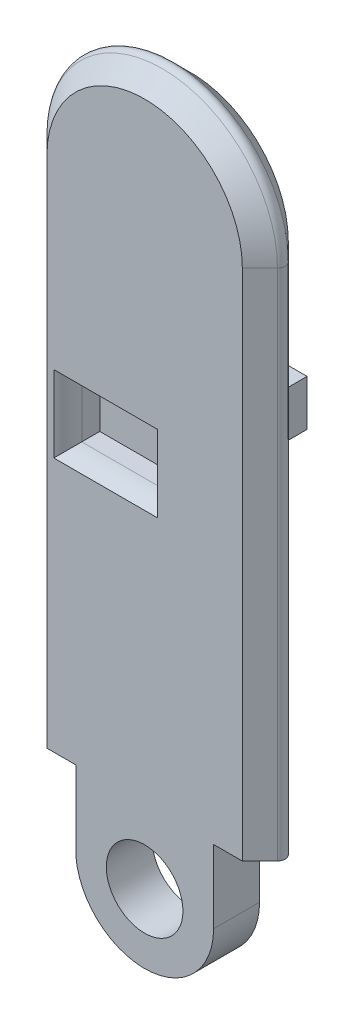
ISO-10303-21;
HEADER;
FILE_DESCRIPTION(('STEP AP214'),'2;1');
FILE_NAME('part.step','',(''),(''),'','','');
FILE_SCHEMA(('AUTOMOTIVE_DESIGN { 1 0 10303 214 1 1 1 1 }'));
ENDSEC;
DATA;
#1=APPLICATION_CONTEXT('core data for automotive mechanical design processes');
#2=APPLICATION_PROTOCOL_DEFINITION('international standard','automotive_design',2000,#1);
#3=PRODUCT_CONTEXT('',#1,'mechanical');
#4=PRODUCT('Part','Part','',(#3));
#5=PRODUCT_RELATED_PRODUCT_CATEGORY('part','',(#4));
#6=PRODUCT_DEFINITION_FORMATION('','',#4);
#7=PRODUCT_DEFINITION_CONTEXT('part definition',#1,'design');
#8=PRODUCT_DEFINITION('design','',#6,#7);
#9=PRODUCT_DEFINITION_SHAPE('','',#8);
#10=(LENGTH_UNIT() NAMED_UNIT(*) SI_UNIT(.MILLI.,.METRE.));
#11=(NAMED_UNIT(*) PLANE_ANGLE_UNIT() SI_UNIT($,.RADIAN.));
#12=(NAMED_UNIT(*) SI_UNIT($,.STERADIAN.) SOLID_ANGLE_UNIT());
#13=UNCERTAINTY_MEASURE_WITH_UNIT(LENGTH_MEASURE(1.E-05),#10,'distance_accuracy_value','');
#14=(GEOMETRIC_REPRESENTATION_CONTEXT(3) GLOBAL_UNCERTAINTY_ASSIGNED_CONTEXT((#13)) GLOBAL_UNIT_ASSIGNED_CONTEXT((#10,
#11,#12)) REPRESENTATION_CONTEXT('',''));
#15=CARTESIAN_POINT('',(0.,0.,0.));
#16=DIRECTION('',(0.,0.,1.));
#17=DIRECTION('',(1.,0.,0.));
#18=AXIS2_PLACEMENT_3D('',#15,#16,#17);
#19=CARTESIAN_POINT('',(0.,0.,-6.));
#20=DIRECTION('',(0.,0.,1.));
#21=DIRECTION('',(1.,0.,0.));
#22=AXIS2_PLACEMENT_3D('',#19,#20,#21);
#23=PLANE('',#22);
#24=CARTESIAN_POINT('',(0.,-43.030823628885,-6.));
#25=DIRECTION('',(0.,0.,1.));
#26=DIRECTION('',(1.,0.,0.));
#27=AXIS2_PLACEMENT_3D('',#24,#25,#26);
#28=CIRCLE('',#27,5.);
#29=CARTESIAN_POINT('',(5.,-43.030823628885,-6.));
#30=VERTEX_POINT('',#29);
#31=EDGE_CURVE('E267',#30,#30,#28,.T.);
#32=ORIENTED_EDGE('',*,*,#31,.T.);
#33=EDGE_LOOP('',(#32));
#34=FACE_BOUND('',#33,.T.);
#35=CARTESIAN_POINT('',(0.,33.5,-6.));
#36=DIRECTION('',(0.,0.,1.));
#37=DIRECTION('',(1.,0.,0.));
#38=AXIS2_PLACEMENT_3D('',#35,#36,#37);
#39=CIRCLE('',#38,12.75);
#40=CARTESIAN_POINT('',(-12.75,33.5,-6.));
#41=VERTEX_POINT('',#40);
#42=CARTESIAN_POINT('',(12.75,33.5,-6.));
#43=VERTEX_POINT('',#42);
#44=EDGE_CURVE('E348',#41,#43,#39,.F.);
#45=ORIENTED_EDGE('',*,*,#44,.T.);
#46=DIRECTION('',(0.,-1.,0.));
#47=VECTOR('',#46,1.);
#48=CARTESIAN_POINT('',(12.75,0.,-6.));
#49=LINE('',#48,#47);
#50=CARTESIAN_POINT('',(12.75,-33.5,-6.));
#51=VERTEX_POINT('',#50);
#52=EDGE_CURVE('E350',#43,#51,#49,.T.);
#53=ORIENTED_EDGE('',*,*,#52,.T.);
#54=DIRECTION('',(1.,0.,0.));
#55=VECTOR('',#54,1.);
#56=CARTESIAN_POINT('',(0.,-33.5,-6.));
#57=LINE('',#56,#55);
#58=CARTESIAN_POINT('',(9.00000000000001,-33.5,-6.));
#59=VERTEX_POINT('',#58);
#60=EDGE_CURVE('E342',#59,#51,#57,.T.);
#61=ORIENTED_EDGE('',*,*,#60,.F.);
#62=DIRECTION('',(0.,1.,0.));
#63=VECTOR('',#62,1.);
#64=CARTESIAN_POINT('',(9.,0.,-6.));
#65=LINE('',#64,#63);
#66=CARTESIAN_POINT('',(9.00000000000001,-43.030823628885,-6.));
#67=VERTEX_POINT('',#66);
#68=EDGE_CURVE('E265',#67,#59,#65,.T.);
#69=ORIENTED_EDGE('',*,*,#68,.F.);
#70=CARTESIAN_POINT('',(0.,-43.030823628885,-6.));
#71=DIRECTION('',(0.,0.,1.));
#72=DIRECTION('',(1.,0.,0.));
#73=AXIS2_PLACEMENT_3D('',#70,#71,#72);
#74=CIRCLE('',#73,9.);
#75=CARTESIAN_POINT('',(-8.97468464942043,-43.7053867789735,-6.));
#76=VERTEX_POINT('',#75);
#77=EDGE_CURVE('E261',#76,#67,#74,.T.);
#78=ORIENTED_EDGE('',*,*,#77,.F.);
#79=DIRECTION('',(0.,-1.,0.));
#80=VECTOR('',#79,1.);
#81=CARTESIAN_POINT('',(-8.97468464942044,0.,-6.));
#82=LINE('',#81,#80);
#83=CARTESIAN_POINT('',(-8.97468464942043,-33.5,-6.));
#84=VERTEX_POINT('',#83);
#85=EDGE_CURVE('E258',#84,#76,#82,.T.);
#86=ORIENTED_EDGE('',*,*,#85,.F.);
#87=CARTESIAN_POINT('',(-12.75,-33.5,-6.));
#88=VERTEX_POINT('',#87);
#89=EDGE_CURVE('E338',#88,#84,#57,.T.);
#90=ORIENTED_EDGE('',*,*,#89,.F.);
#91=DIRECTION('',(0.,1.,0.));
#92=VECTOR('',#91,1.);
#93=CARTESIAN_POINT('',(-12.75,33.5,-6.));
#94=LINE('',#93,#92);
#95=EDGE_CURVE('E341',#88,#41,#94,.T.);
#96=ORIENTED_EDGE('',*,*,#95,.T.);
#97=EDGE_LOOP('',(#45,#53,#61,#69,#78,#86,#90,#96));
#98=FACE_BOUND('',#97,.T.);
#99=DIRECTION('',(0.,-1.,0.));
#100=VECTOR('',#99,1.);
#101=CARTESIAN_POINT('',(-1.5,-31.2388673363516,-6.));
#102=LINE('',#101,#100);
#103=CARTESIAN_POINT('',(-1.5,-24.2388673363516,-6.));
#104=VERTEX_POINT('',#103);
#105=CARTESIAN_POINT('',(-1.5,-31.2388673363516,-6.));
#106=VERTEX_POINT('',#105);
#107=EDGE_CURVE('E302',#104,#106,#102,.T.);
#108=ORIENTED_EDGE('',*,*,#107,.F.);
#109=DIRECTION('',(-1.,0.,0.));
#110=VECTOR('',#109,1.);
#111=CARTESIAN_POINT('',(0.,-24.2388673363516,-6.));
#112=LINE('',#111,#110);
#113=CARTESIAN_POINT('',(-10.5,-24.2388673363516,-6.));
#114=VERTEX_POINT('',#113);
#115=EDGE_CURVE('E407',#104,#114,#112,.T.);
#116=ORIENTED_EDGE('',*,*,#115,.T.);
#117=DIRECTION('',(0.,1.,0.));
#118=VECTOR('',#117,1.);
#119=CARTESIAN_POINT('',(-10.5,-31.2388673363516,-6.));
#120=LINE('',#119,#118);
#121=CARTESIAN_POINT('',(-10.5,-31.2388673363516,-6.));
#122=VERTEX_POINT('',#121);
#123=EDGE_CURVE('E280',#122,#114,#120,.T.);
#124=ORIENTED_EDGE('',*,*,#123,.F.);
#125=DIRECTION('',(-1.,0.,0.));
#126=VECTOR('',#125,1.);
#127=CARTESIAN_POINT('',(-1.5,-31.2388673363516,-6.));
#128=LINE('',#127,#126);
#129=EDGE_CURVE('E291',#106,#122,#128,.T.);
#130=ORIENTED_EDGE('',*,*,#129,.F.);
#131=EDGE_LOOP('',(#108,#116,#124,#130));
#132=FACE_BOUND('',#131,.T.);
#133=DIRECTION('',(1.,0.,0.));
#134=VECTOR('',#133,1.);
#135=CARTESIAN_POINT('',(0.,15.,-6.));
#136=LINE('',#135,#134);
#137=CARTESIAN_POINT('',(6.3,15.,-6.));
#138=VERTEX_POINT('',#137);
#139=CARTESIAN_POINT('',(10.7,15.,-6.));
#140=VERTEX_POINT('',#139);
#141=EDGE_CURVE('E247',#138,#140,#136,.T.);
#142=ORIENTED_EDGE('',*,*,#141,.F.);
#143=DIRECTION('',(0.,-1.,0.));
#144=VECTOR('',#143,1.);
#145=CARTESIAN_POINT('',(6.3,0.,-6.));
#146=LINE('',#145,#144);
#147=CARTESIAN_POINT('',(6.3,9.,-6.));
#148=VERTEX_POINT('',#147);
#149=EDGE_CURVE('E243',#138,#148,#146,.T.);
#150=ORIENTED_EDGE('',*,*,#149,.T.);
#151=DIRECTION('',(1.,0.,0.));
#152=VECTOR('',#151,1.);
#153=CARTESIAN_POINT('',(0.,9.,-6.));
#154=LINE('',#153,#152);
#155=CARTESIAN_POINT('',(10.7,9.,-6.));
#156=VERTEX_POINT('',#155);
#157=EDGE_CURVE('E445',#148,#156,#154,.T.);
#158=ORIENTED_EDGE('',*,*,#157,.T.);
#159=DIRECTION('',(0.,-1.,0.));
#160=VECTOR('',#159,1.);
#161=CARTESIAN_POINT('',(10.7,0.,-6.));
#162=LINE('',#161,#160);
#163=EDGE_CURVE('E443',#140,#156,#162,.T.);
#164=ORIENTED_EDGE('',*,*,#163,.F.);
#165=EDGE_LOOP('',(#142,#150,#158,#164));
#166=FACE_BOUND('',#165,.T.);
#167=ADVANCED_FACE('F45',(#34,#98,#132,#166),#23,.F.);
#168=CARTESIAN_POINT('',(0.,-33.5,-6.));
#169=DIRECTION('',(0.,-1.,0.));
#170=DIRECTION('',(0.,0.,-1.));
#171=AXIS2_PLACEMENT_3D('',#168,#169,#170);
#172=PLANE('',#171);
#173=ORIENTED_EDGE('',*,*,#89,.T.);
#174=DIRECTION('',(0.,0.,1.));
#175=VECTOR('',#174,1.);
#176=CARTESIAN_POINT('',(-8.97468464942043,-33.5,-6.));
#177=LINE('',#176,#175);
#178=CARTESIAN_POINT('',(-8.97468464942043,-33.5,0.));
#179=VERTEX_POINT('',#178);
#180=EDGE_CURVE('E269',#84,#179,#177,.T.);
#181=ORIENTED_EDGE('',*,*,#180,.T.);
#182=DIRECTION('',(1.,0.,0.));
#183=VECTOR('',#182,1.);
#184=CARTESIAN_POINT('',(0.,-33.5,0.));
#185=LINE('',#184,#183);
#186=CARTESIAN_POINT('',(-12.75,-33.5,0.));
#187=VERTEX_POINT('',#186);
#188=EDGE_CURVE('E343',#187,#179,#185,.T.);
#189=ORIENTED_EDGE('',*,*,#188,.F.);
#190=DIRECTION('',(0.707106781186546,0.,0.707106781186549));
#191=VECTOR('',#190,1.);
#192=CARTESIAN_POINT('',(-9.37500000000003,-33.5,3.37499999999999));
#193=LINE('',#192,#191);
#194=CARTESIAN_POINT('',(-15.0428932188135,-33.5,-2.29289321881346));
#195=VERTEX_POINT('',#194);
#196=EDGE_CURVE('E353',#187,#195,#193,.F.);
#197=ORIENTED_EDGE('',*,*,#196,.T.);
#198=CARTESIAN_POINT('',(-14.3357864376269,-33.5,-3.));
#199=DIRECTION('',(0.,-1.,0.));
#200=DIRECTION('',(0.,0.,-1.));
#201=AXIS2_PLACEMENT_3D('',#198,#199,#200);
#202=CIRCLE('',#201,1.);
#203=CARTESIAN_POINT('',(-15.0428932188135,-33.5,-3.70710678118655));
#204=VERTEX_POINT('',#203);
#205=EDGE_CURVE('E386',#195,#204,#202,.T.);
#206=ORIENTED_EDGE('',*,*,#205,.T.);
#207=DIRECTION('',(0.707106781186549,0.,-0.707106781186546));
#208=VECTOR('',#207,1.);
#209=CARTESIAN_POINT('',(-6.37499999999997,-33.5,-12.375));
#210=LINE('',#209,#208);
#211=EDGE_CURVE('E356',#204,#88,#210,.T.);
#212=ORIENTED_EDGE('',*,*,#211,.T.);
#213=EDGE_LOOP('',(#173,#181,#189,#197,#206,#212));
#214=FACE_BOUND('',#213,.T.);
#215=ADVANCED_FACE('F471',(#214),#172,.T.);
#216=DIRECTION('',(0.,0.,1.));
#217=VECTOR('',#216,1.);
#218=CARTESIAN_POINT('',(9.00000000000001,-33.5,-6.));
#219=LINE('',#218,#217);
#220=CARTESIAN_POINT('',(9.00000000000001,-33.5,0.));
#221=VERTEX_POINT('',#220);
#222=EDGE_CURVE('E278',#59,#221,#219,.T.);
#223=ORIENTED_EDGE('',*,*,#222,.F.);
#224=ORIENTED_EDGE('',*,*,#60,.T.);
#225=DIRECTION('',(-0.707106781186549,0.,-0.707106781186546));
#226=VECTOR('',#225,1.);
#227=CARTESIAN_POINT('',(6.37499999999997,-33.5,-12.375));
#228=LINE('',#227,#226);
#229=CARTESIAN_POINT('',(15.0428932188135,-33.5,-3.70710678118655));
#230=VERTEX_POINT('',#229);
#231=EDGE_CURVE('E361',#51,#230,#228,.F.);
#232=ORIENTED_EDGE('',*,*,#231,.T.);
#233=CARTESIAN_POINT('',(14.3357864376269,-33.5,-3.));
#234=DIRECTION('',(0.,-1.,0.));
#235=DIRECTION('',(0.,0.,-1.));
#236=AXIS2_PLACEMENT_3D('',#233,#234,#235);
#237=CIRCLE('',#236,1.);
#238=CARTESIAN_POINT('',(15.0428932188135,-33.5,-2.29289321881346));
#239=VERTEX_POINT('',#238);
#240=EDGE_CURVE('E388',#230,#239,#237,.T.);
#241=ORIENTED_EDGE('',*,*,#240,.T.);
#242=DIRECTION('',(-0.707106781186546,0.,0.707106781186549));
#243=VECTOR('',#242,1.);
#244=CARTESIAN_POINT('',(9.37500000000004,-33.5,3.37499999999999));
#245=LINE('',#244,#243);
#246=CARTESIAN_POINT('',(12.75,-33.5,0.));
#247=VERTEX_POINT('',#246);
#248=EDGE_CURVE('E358',#239,#247,#245,.T.);
#249=ORIENTED_EDGE('',*,*,#248,.T.);
#250=EDGE_CURVE('E346',#221,#247,#185,.T.);
#251=ORIENTED_EDGE('',*,*,#250,.F.);
#252=EDGE_LOOP('',(#223,#224,#232,#241,#249,#251));
#253=FACE_BOUND('',#252,.T.);
#254=ADVANCED_FACE('F479',(#253),#172,.T.);
#255=CARTESIAN_POINT('',(0.,0.,0.));
#256=DIRECTION('',(0.,0.,1.));
#257=DIRECTION('',(1.,0.,0.));
#258=AXIS2_PLACEMENT_3D('',#255,#256,#257);
#259=PLANE('',#258);
#260=DIRECTION('',(-1.,0.,0.));
#261=VECTOR('',#260,1.);
#262=CARTESIAN_POINT('',(-10.85,-0.250000000000089,0.));
#263=LINE('',#262,#261);
#264=CARTESIAN_POINT('',(1.65,-0.250000000000089,0.));
#265=VERTEX_POINT('',#264);
#266=CARTESIAN_POINT('',(-11.85,-0.250000000000089,0.));
#267=VERTEX_POINT('',#266);
#268=EDGE_CURVE('E415',#265,#267,#263,.T.);
#269=ORIENTED_EDGE('',*,*,#268,.T.);
#270=DIRECTION('',(0.,1.,0.));
#271=VECTOR('',#270,1.);
#272=CARTESIAN_POINT('',(-11.85,8.74999999999992,0.));
#273=LINE('',#272,#271);
#274=CARTESIAN_POINT('',(-11.85,9.74999999999993,0.));
#275=VERTEX_POINT('',#274);
#276=EDGE_CURVE('E421',#267,#275,#273,.T.);
#277=ORIENTED_EDGE('',*,*,#276,.T.);
#278=DIRECTION('',(1.,0.,0.));
#279=VECTOR('',#278,1.);
#280=CARTESIAN_POINT('',(0.649999999999991,9.74999999999993,0.));
#281=LINE('',#280,#279);
#282=CARTESIAN_POINT('',(1.65,9.74999999999993,0.));
#283=VERTEX_POINT('',#282);
#284=EDGE_CURVE('E419',#275,#283,#281,.T.);
#285=ORIENTED_EDGE('',*,*,#284,.T.);
#286=DIRECTION('',(0.,-1.,0.));
#287=VECTOR('',#286,1.);
#288=CARTESIAN_POINT('',(1.65,0.74999999999992,0.));
#289=LINE('',#288,#287);
#290=EDGE_CURVE('E417',#283,#265,#289,.T.);
#291=ORIENTED_EDGE('',*,*,#290,.T.);
#292=EDGE_LOOP('',(#269,#277,#285,#291));
#293=FACE_BOUND('',#292,.T.);
#294=ORIENTED_EDGE('',*,*,#188,.T.);
#295=DIRECTION('',(0.,-1.,0.));
#296=VECTOR('',#295,1.);
#297=CARTESIAN_POINT('',(-8.97468464942044,0.,0.));
#298=LINE('',#297,#296);
#299=CARTESIAN_POINT('',(-8.97468464942043,-43.7053867789735,0.));
#300=VERTEX_POINT('',#299);
#301=EDGE_CURVE('E249',#179,#300,#298,.T.);
#302=ORIENTED_EDGE('',*,*,#301,.T.);
#303=CARTESIAN_POINT('',(0.,-43.030823628885,0.));
#304=DIRECTION('',(0.,0.,1.));
#305=DIRECTION('',(1.,0.,0.));
#306=AXIS2_PLACEMENT_3D('',#303,#304,#305);
#307=CIRCLE('',#306,9.);
#308=CARTESIAN_POINT('',(9.00000000000001,-43.030823628885,0.));
#309=VERTEX_POINT('',#308);
#310=EDGE_CURVE('E252',#300,#309,#307,.T.);
#311=ORIENTED_EDGE('',*,*,#310,.T.);
#312=DIRECTION('',(0.,1.,0.));
#313=VECTOR('',#312,1.);
#314=CARTESIAN_POINT('',(9.,0.,0.));
#315=LINE('',#314,#313);
#316=EDGE_CURVE('E273',#309,#221,#315,.T.);
#317=ORIENTED_EDGE('',*,*,#316,.T.);
#318=ORIENTED_EDGE('',*,*,#250,.T.);
#319=DIRECTION('',(0.,1.,0.));
#320=VECTOR('',#319,1.);
#321=CARTESIAN_POINT('',(12.75,33.5,0.));
#322=LINE('',#321,#320);
#323=CARTESIAN_POINT('',(12.75,33.5,0.));
#324=VERTEX_POINT('',#323);
#325=EDGE_CURVE('E369',#247,#324,#322,.T.);
#326=ORIENTED_EDGE('',*,*,#325,.T.);
#327=CARTESIAN_POINT('',(0.,33.5,0.));
#328=DIRECTION('',(0.,0.,1.));
#329=DIRECTION('',(1.,0.,0.));
#330=AXIS2_PLACEMENT_3D('',#327,#328,#329);
#331=CIRCLE('',#330,12.75);
#332=CARTESIAN_POINT('',(-12.75,33.5,0.));
#333=VERTEX_POINT('',#332);
#334=EDGE_CURVE('E366',#324,#333,#331,.T.);
#335=ORIENTED_EDGE('',*,*,#334,.T.);
#336=DIRECTION('',(0.,-1.,0.));
#337=VECTOR('',#336,1.);
#338=CARTESIAN_POINT('',(-12.75,0.,0.));
#339=LINE('',#338,#337);
#340=EDGE_CURVE('E364',#333,#187,#339,.T.);
#341=ORIENTED_EDGE('',*,*,#340,.T.);
#342=EDGE_LOOP('',(#294,#302,#311,#317,#318,#326,#335,#341));
#343=FACE_BOUND('',#342,.T.);
#344=CARTESIAN_POINT('',(0.,-43.030823628885,0.));
#345=DIRECTION('',(0.,0.,1.));
#346=DIRECTION('',(1.,0.,0.));
#347=AXIS2_PLACEMENT_3D('',#344,#345,#346);
#348=CIRCLE('',#347,5.);
#349=CARTESIAN_POINT('',(5.,-43.030823628885,0.));
#350=VERTEX_POINT('',#349);
#351=EDGE_CURVE('E262',#350,#350,#348,.T.);
#352=ORIENTED_EDGE('',*,*,#351,.F.);
#353=EDGE_LOOP('',(#352));
#354=FACE_BOUND('',#353,.T.);
#355=ADVANCED_FACE('F487',(#293,#343,#354),#259,.T.);
#356=CARTESIAN_POINT('',(-12.75,0.,0.));
#357=DIRECTION('',(0.707106781186549,0.,-0.707106781186546));
#358=DIRECTION('',(0.,-1.,0.));
#359=AXIS2_PLACEMENT_3D('',#356,#357,#358);
#360=PLANE('',#359);
#361=DIRECTION('',(0.707106781186546,0.,0.707106781186549));
#362=VECTOR('',#361,1.);
#363=CARTESIAN_POINT('',(-15.75,33.5,-3.));
#364=LINE('',#363,#362);
#365=CARTESIAN_POINT('',(-15.0428932188135,33.5,-2.29289321881346));
#366=VERTEX_POINT('',#365);
#367=EDGE_CURVE('E382',#366,#333,#364,.T.);
#368=ORIENTED_EDGE('',*,*,#367,.F.);
#369=DIRECTION('',(0.,1.,0.));
#370=VECTOR('',#369,1.);
#371=CARTESIAN_POINT('',(-15.0428932188135,0.,-2.29289321881346));
#372=LINE('',#371,#370);
#373=EDGE_CURVE('E398',#366,#195,#372,.F.);
#374=ORIENTED_EDGE('',*,*,#373,.T.);
#375=ORIENTED_EDGE('',*,*,#196,.F.);
#376=ORIENTED_EDGE('',*,*,#340,.F.);
#377=EDGE_LOOP('',(#368,#374,#375,#376));
#378=FACE_BOUND('',#377,.T.);
#379=ADVANCED_FACE('F489',(#378),#360,.F.);
#380=CARTESIAN_POINT('',(0.,33.5,0.));
#381=DIRECTION('',(0.,0.,-1.));
#382=DIRECTION('',(-1.,0.,0.));
#383=AXIS2_PLACEMENT_3D('',#380,#381,#382);
#384=CONICAL_SURFACE('',#383,12.75,0.785398163397446);
#385=DIRECTION('',(-0.707106781186546,0.,0.707106781186549));
#386=VECTOR('',#385,1.);
#387=CARTESIAN_POINT('',(15.75,33.5,-3.));
#388=LINE('',#387,#386);
#389=CARTESIAN_POINT('',(15.0428932188135,33.5,-2.29289321881346));
#390=VERTEX_POINT('',#389);
#391=EDGE_CURVE('E380',#390,#324,#388,.T.);
#392=ORIENTED_EDGE('',*,*,#391,.F.);
#393=CARTESIAN_POINT('',(0.,33.5,-2.29289321881346));
#394=DIRECTION('',(0.,0.,1.));
#395=DIRECTION('',(1.,0.,0.));
#396=AXIS2_PLACEMENT_3D('',#393,#394,#395);
#397=CIRCLE('',#396,15.0428932188135);
#398=EDGE_CURVE('E394',#390,#366,#397,.T.);
#399=ORIENTED_EDGE('',*,*,#398,.T.);
#400=ORIENTED_EDGE('',*,*,#367,.T.);
#401=ORIENTED_EDGE('',*,*,#334,.F.);
#402=EDGE_LOOP('',(#392,#399,#400,#401));
#403=FACE_BOUND('',#402,.T.);
#404=ADVANCED_FACE('F524',(#403),#384,.T.);
#405=CARTESIAN_POINT('',(-15.75,0.,-3.00000000000001));
#406=DIRECTION('',(-0.707106781186546,0.,-0.707106781186549));
#407=DIRECTION('',(0.,1.,0.));
#408=AXIS2_PLACEMENT_3D('',#405,#406,#407);
#409=PLANE('',#408);
#410=ORIENTED_EDGE('',*,*,#211,.F.);
#411=DIRECTION('',(0.,-1.,0.));
#412=VECTOR('',#411,1.);
#413=CARTESIAN_POINT('',(-15.0428932188135,0.,-3.70710678118655));
#414=LINE('',#413,#412);
#415=CARTESIAN_POINT('',(-15.0428932188135,33.5,-3.70710678118655));
#416=VERTEX_POINT('',#415);
#417=EDGE_CURVE('E396',#204,#416,#414,.F.);
#418=ORIENTED_EDGE('',*,*,#417,.T.);
#419=DIRECTION('',(-0.707106781186549,0.,0.707106781186546));
#420=VECTOR('',#419,1.);
#421=CARTESIAN_POINT('',(-12.75,33.5,-6.));
#422=LINE('',#421,#420);
#423=EDGE_CURVE('E376',#41,#416,#422,.T.);
#424=ORIENTED_EDGE('',*,*,#423,.F.);
#425=ORIENTED_EDGE('',*,*,#95,.F.);
#426=EDGE_LOOP('',(#410,#418,#424,#425));
#427=FACE_BOUND('',#426,.T.);
#428=ADVANCED_FACE('F517',(#427),#409,.T.);
#429=CARTESIAN_POINT('',(15.75,0.,-3.));
#430=DIRECTION('',(0.707106781186549,0.,0.707106781186546));
#431=DIRECTION('',(0.,1.,0.));
#432=AXIS2_PLACEMENT_3D('',#429,#430,#431);
#433=PLANE('',#432);
#434=ORIENTED_EDGE('',*,*,#248,.F.);
#435=DIRECTION('',(0.,1.,0.));
#436=VECTOR('',#435,1.);
#437=CARTESIAN_POINT('',(15.0428932188135,0.,-2.29289321881346));
#438=LINE('',#437,#436);
#439=EDGE_CURVE('E390',#239,#390,#438,.T.);
#440=ORIENTED_EDGE('',*,*,#439,.T.);
#441=ORIENTED_EDGE('',*,*,#391,.T.);
#442=ORIENTED_EDGE('',*,*,#325,.F.);
#443=EDGE_LOOP('',(#434,#440,#441,#442));
#444=FACE_BOUND('',#443,.T.);
#445=ADVANCED_FACE('F510',(#444),#433,.T.);
#446=CARTESIAN_POINT('',(0.,33.5,-3.00000000000001));
#447=DIRECTION('',(0.,0.,1.));
#448=DIRECTION('',(1.,0.,0.));
#449=AXIS2_PLACEMENT_3D('',#446,#447,#448);
#450=CONICAL_SURFACE('',#449,15.75,0.785398163397451);
#451=ORIENTED_EDGE('',*,*,#423,.T.);
#452=CARTESIAN_POINT('',(0.,33.5,-3.70710678118655));
#453=DIRECTION('',(0.,0.,-1.));
#454=DIRECTION('',(-1.,0.,0.));
#455=AXIS2_PLACEMENT_3D('',#452,#453,#454);
#456=CIRCLE('',#455,15.0428932188135);
#457=CARTESIAN_POINT('',(15.0428932188135,33.5,-3.70710678118655));
#458=VERTEX_POINT('',#457);
#459=EDGE_CURVE('E392',#416,#458,#456,.T.);
#460=ORIENTED_EDGE('',*,*,#459,.T.);
#461=DIRECTION('',(0.707106781186549,0.,0.707106781186546));
#462=VECTOR('',#461,1.);
#463=CARTESIAN_POINT('',(12.75,33.5,-6.));
#464=LINE('',#463,#462);
#465=EDGE_CURVE('E373',#43,#458,#464,.T.);
#466=ORIENTED_EDGE('',*,*,#465,.F.);
#467=ORIENTED_EDGE('',*,*,#44,.F.);
#468=EDGE_LOOP('',(#451,#460,#466,#467));
#469=FACE_BOUND('',#468,.T.);
#470=ADVANCED_FACE('F503',(#469),#450,.T.);
#471=CARTESIAN_POINT('',(12.75,0.,-6.));
#472=DIRECTION('',(-0.707106781186546,0.,0.707106781186549));
#473=DIRECTION('',(0.,-1.,0.));
#474=AXIS2_PLACEMENT_3D('',#471,#472,#473);
#475=PLANE('',#474);
#476=ORIENTED_EDGE('',*,*,#465,.T.);
#477=DIRECTION('',(0.,-1.,0.));
#478=VECTOR('',#477,1.);
#479=CARTESIAN_POINT('',(15.0428932188135,0.,-3.70710678118655));
#480=LINE('',#479,#478);
#481=EDGE_CURVE('E372',#458,#230,#480,.T.);
#482=ORIENTED_EDGE('',*,*,#481,.T.);
#483=ORIENTED_EDGE('',*,*,#231,.F.);
#484=ORIENTED_EDGE('',*,*,#52,.F.);
#485=EDGE_LOOP('',(#476,#482,#483,#484));
#486=FACE_BOUND('',#485,.T.);
#487=ADVANCED_FACE('F495',(#486),#475,.F.);
#488=CARTESIAN_POINT('',(-14.3357864376269,0.,-3.));
#489=DIRECTION('',(0.,-1.,0.));
#490=DIRECTION('',(1.,0.,0.));
#491=AXIS2_PLACEMENT_3D('',#488,#489,#490);
#492=CYLINDRICAL_SURFACE('',#491,1.);
#493=ORIENTED_EDGE('',*,*,#205,.F.);
#494=ORIENTED_EDGE('',*,*,#373,.F.);
#495=CARTESIAN_POINT('',(-14.3357864376269,33.5,-3.));
#496=DIRECTION('',(0.,1.,0.));
#497=DIRECTION('',(0.,0.,1.));
#498=AXIS2_PLACEMENT_3D('',#495,#496,#497);
#499=CIRCLE('',#498,1.);
#500=EDGE_CURVE('E377',#416,#366,#499,.T.);
#501=ORIENTED_EDGE('',*,*,#500,.F.);
#502=ORIENTED_EDGE('',*,*,#417,.F.);
#503=EDGE_LOOP('',(#493,#494,#501,#502));
#504=FACE_BOUND('',#503,.T.);
#505=ADVANCED_FACE('F502',(#504),#492,.T.);
#506=CARTESIAN_POINT('',(0.,33.5,-3.));
#507=DIRECTION('',(0.,0.,1.));
#508=DIRECTION('',(1.,0.,0.));
#509=AXIS2_PLACEMENT_3D('',#506,#507,#508);
#510=TOROIDAL_SURFACE('',#509,14.3357864376269,1.);
#511=ORIENTED_EDGE('',*,*,#500,.T.);
#512=ORIENTED_EDGE('',*,*,#398,.F.);
#513=CARTESIAN_POINT('',(14.3357864376269,33.5,-3.));
#514=DIRECTION('',(0.,-1.,0.));
#515=DIRECTION('',(0.,0.,-1.));
#516=AXIS2_PLACEMENT_3D('',#513,#514,#515);
#517=CIRCLE('',#516,1.);
#518=EDGE_CURVE('E332',#458,#390,#517,.T.);
#519=ORIENTED_EDGE('',*,*,#518,.F.);
#520=ORIENTED_EDGE('',*,*,#459,.F.);
#521=EDGE_LOOP('',(#511,#512,#519,#520));
#522=FACE_BOUND('',#521,.T.);
#523=ADVANCED_FACE('F540',(#522),#510,.T.);
#524=CARTESIAN_POINT('',(14.3357864376269,0.,-3.));
#525=DIRECTION('',(0.,1.,0.));
#526=DIRECTION('',(-1.,0.,0.));
#527=AXIS2_PLACEMENT_3D('',#524,#525,#526);
#528=CYLINDRICAL_SURFACE('',#527,1.);
#529=ORIENTED_EDGE('',*,*,#518,.T.);
#530=ORIENTED_EDGE('',*,*,#439,.F.);
#531=ORIENTED_EDGE('',*,*,#240,.F.);
#532=ORIENTED_EDGE('',*,*,#481,.F.);
#533=EDGE_LOOP('',(#529,#530,#531,#532));
#534=FACE_BOUND('',#533,.T.);
#535=ADVANCED_FACE('F537',(#534),#528,.T.);
#536=CARTESIAN_POINT('',(-10.85,8.74999999999992,-5.));
#537=DIRECTION('',(-1.,0.,0.));
#538=DIRECTION('',(0.,0.,1.));
#539=AXIS2_PLACEMENT_3D('',#536,#537,#538);
#540=PLANE('',#539);
#541=DIRECTION('',(0.,0.,1.));
#542=VECTOR('',#541,1.);
#543=CARTESIAN_POINT('',(-10.85,8.74999999999992,-5.));
#544=LINE('',#543,#542);
#545=CARTESIAN_POINT('',(-10.85,8.74999999999992,-5.));
#546=VERTEX_POINT('',#545);
#547=CARTESIAN_POINT('',(-10.85,8.74999999999992,-2.6457513110646));
#548=VERTEX_POINT('',#547);
#549=EDGE_CURVE('E329',#546,#548,#544,.T.);
#550=ORIENTED_EDGE('',*,*,#549,.T.);
#551=DIRECTION('',(0.,-1.,0.));
#552=VECTOR('',#551,1.);
#553=CARTESIAN_POINT('',(-10.85,8.74999999999992,-2.6457513110646));
#554=LINE('',#553,#552);
#555=CARTESIAN_POINT('',(-10.85,0.749999999999919,-2.6457513110646));
#556=VERTEX_POINT('',#555);
#557=EDGE_CURVE('E424',#548,#556,#554,.T.);
#558=ORIENTED_EDGE('',*,*,#557,.T.);
#559=DIRECTION('',(0.,0.,1.));
#560=VECTOR('',#559,1.);
#561=CARTESIAN_POINT('',(-10.85,0.749999999999919,-5.));
#562=LINE('',#561,#560);
#563=CARTESIAN_POINT('',(-10.85,0.749999999999919,-5.));
#564=VERTEX_POINT('',#563);
#565=EDGE_CURVE('E328',#564,#556,#562,.T.);
#566=ORIENTED_EDGE('',*,*,#565,.F.);
#567=DIRECTION('',(0.,-1.,0.));
#568=VECTOR('',#567,1.);
#569=CARTESIAN_POINT('',(-10.85,8.74999999999992,-5.));
#570=LINE('',#569,#568);
#571=EDGE_CURVE('E309',#546,#564,#570,.T.);
#572=ORIENTED_EDGE('',*,*,#571,.F.);
#573=EDGE_LOOP('',(#550,#558,#566,#572));
#574=FACE_BOUND('',#573,.T.);
#575=ADVANCED_FACE('F485',(#574),#540,.F.);
#576=CARTESIAN_POINT('',(0.649999999999991,8.74999999999992,-5.));
#577=DIRECTION('',(0.,1.,0.));
#578=DIRECTION('',(0.,0.,1.));
#579=AXIS2_PLACEMENT_3D('',#576,#577,#578);
#580=PLANE('',#579);
#581=DIRECTION('',(0.,0.,1.));
#582=VECTOR('',#581,1.);
#583=CARTESIAN_POINT('',(0.649999999999991,8.74999999999992,-5.));
#584=LINE('',#583,#582);
#585=CARTESIAN_POINT('',(0.649999999999991,8.74999999999992,-5.));
#586=VERTEX_POINT('',#585);
#587=CARTESIAN_POINT('',(0.649999999999991,8.74999999999992,-2.6457513110646));
#588=VERTEX_POINT('',#587);
#589=EDGE_CURVE('E333',#586,#588,#584,.T.);
#590=ORIENTED_EDGE('',*,*,#589,.T.);
#591=DIRECTION('',(-1.,0.,0.));
#592=VECTOR('',#591,1.);
#593=CARTESIAN_POINT('',(0.649999999999991,8.74999999999992,-2.6457513110646));
#594=LINE('',#593,#592);
#595=EDGE_CURVE('E427',#588,#548,#594,.T.);
#596=ORIENTED_EDGE('',*,*,#595,.T.);
#597=ORIENTED_EDGE('',*,*,#549,.F.);
#598=DIRECTION('',(-1.,0.,0.));
#599=VECTOR('',#598,1.);
#600=CARTESIAN_POINT('',(0.649999999999991,8.74999999999992,-5.));
#601=LINE('',#600,#599);
#602=EDGE_CURVE('E325',#586,#546,#601,.T.);
#603=ORIENTED_EDGE('',*,*,#602,.F.);
#604=EDGE_LOOP('',(#590,#596,#597,#603));
#605=FACE_BOUND('',#604,.T.);
#606=ADVANCED_FACE('F580',(#605),#580,.F.);
#607=CARTESIAN_POINT('',(0.649999999999991,8.74999999999992,-5.));
#608=DIRECTION('',(1.,0.,0.));
#609=DIRECTION('',(0.,1.,0.));
#610=AXIS2_PLACEMENT_3D('',#607,#608,#609);
#611=PLANE('',#610);
#612=DIRECTION('',(0.,0.,1.));
#613=VECTOR('',#612,1.);
#614=CARTESIAN_POINT('',(0.649999999999994,0.749999999999919,-5.));
#615=LINE('',#614,#613);
#616=CARTESIAN_POINT('',(0.649999999999994,0.749999999999919,-5.));
#617=VERTEX_POINT('',#616);
#618=CARTESIAN_POINT('',(0.649999999999994,0.749999999999919,-2.6457513110646));
#619=VERTEX_POINT('',#618);
#620=EDGE_CURVE('E335',#617,#619,#615,.T.);
#621=ORIENTED_EDGE('',*,*,#620,.T.);
#622=DIRECTION('',(0.,1.,0.));
#623=VECTOR('',#622,1.);
#624=CARTESIAN_POINT('',(0.649999999999991,8.74999999999992,-2.6457513110646));
#625=LINE('',#624,#623);
#626=EDGE_CURVE('E54',#619,#588,#625,.T.);
#627=ORIENTED_EDGE('',*,*,#626,.T.);
#628=ORIENTED_EDGE('',*,*,#589,.F.);
#629=DIRECTION('',(0.,1.,0.));
#630=VECTOR('',#629,1.);
#631=CARTESIAN_POINT('',(0.649999999999991,8.74999999999992,-5.));
#632=LINE('',#631,#630);
#633=EDGE_CURVE('E322',#617,#586,#632,.T.);
#634=ORIENTED_EDGE('',*,*,#633,.F.);
#635=EDGE_LOOP('',(#621,#627,#628,#634));
#636=FACE_BOUND('',#635,.T.);
#637=ADVANCED_FACE('F588',(#636),#611,.F.);
#638=CARTESIAN_POINT('',(0.649999999999994,0.749999999999919,-5.));
#639=DIRECTION('',(0.,-1.,0.));
#640=DIRECTION('',(0.,0.,-1.));
#641=AXIS2_PLACEMENT_3D('',#638,#639,#640);
#642=PLANE('',#641);
#643=ORIENTED_EDGE('',*,*,#565,.T.);
#644=DIRECTION('',(1.,0.,0.));
#645=VECTOR('',#644,1.);
#646=CARTESIAN_POINT('',(0.649999999999994,0.749999999999919,-2.6457513110646));
#647=LINE('',#646,#645);
#648=EDGE_CURVE('E11',#556,#619,#647,.T.);
#649=ORIENTED_EDGE('',*,*,#648,.T.);
#650=ORIENTED_EDGE('',*,*,#620,.F.);
#651=DIRECTION('',(1.,0.,0.));
#652=VECTOR('',#651,1.);
#653=CARTESIAN_POINT('',(0.649999999999994,0.749999999999919,-5.));
#654=LINE('',#653,#652);
#655=EDGE_CURVE('E319',#564,#617,#654,.T.);
#656=ORIENTED_EDGE('',*,*,#655,.F.);
#657=EDGE_LOOP('',(#643,#649,#650,#656));
#658=FACE_BOUND('',#657,.T.);
#659=ADVANCED_FACE('F589',(#658),#642,.F.);
#660=CARTESIAN_POINT('',(0.,0.,-5.));
#661=DIRECTION('',(0.,0.,-1.));
#662=DIRECTION('',(-1.,0.,0.));
#663=AXIS2_PLACEMENT_3D('',#660,#661,#662);
#664=PLANE('',#663);
#665=ORIENTED_EDGE('',*,*,#571,.T.);
#666=ORIENTED_EDGE('',*,*,#655,.T.);
#667=ORIENTED_EDGE('',*,*,#633,.T.);
#668=ORIENTED_EDGE('',*,*,#602,.T.);
#669=EDGE_LOOP('',(#665,#666,#667,#668));
#670=FACE_BOUND('',#669,.T.);
#671=ADVANCED_FACE('F586',(#670),#664,.F.);
#672=CARTESIAN_POINT('',(-10.5,-31.2388673363516,-1.5));
#673=DIRECTION('',(-1.,0.,0.));
#674=DIRECTION('',(0.,0.,1.));
#675=AXIS2_PLACEMENT_3D('',#672,#673,#674);
#676=PLANE('',#675);
#677=ORIENTED_EDGE('',*,*,#123,.T.);
#678=DIRECTION('',(0.,0.707106781186552,-0.707106781186543));
#679=VECTOR('',#678,1.);
#680=CARTESIAN_POINT('',(-10.5,-29.9888673363517,-0.250000000000035));
#681=LINE('',#680,#679);
#682=CARTESIAN_POINT('',(-10.5,-24.7388673363516,-5.50000000000001));
#683=VERTEX_POINT('',#682);
#684=EDGE_CURVE('E413',#114,#683,#681,.F.);
#685=ORIENTED_EDGE('',*,*,#684,.T.);
#686=DIRECTION('',(0.,0.,-1.));
#687=VECTOR('',#686,1.);
#688=CARTESIAN_POINT('',(-10.5,-24.7388673363516,-1.5));
#689=LINE('',#688,#687);
#690=CARTESIAN_POINT('',(-10.5,-24.7388673363516,-1.5));
#691=VERTEX_POINT('',#690);
#692=EDGE_CURVE('E300',#691,#683,#689,.T.);
#693=ORIENTED_EDGE('',*,*,#692,.F.);
#694=DIRECTION('',(0.,1.,0.));
#695=VECTOR('',#694,1.);
#696=CARTESIAN_POINT('',(-10.5,-31.2388673363516,-1.5));
#697=LINE('',#696,#695);
#698=CARTESIAN_POINT('',(-10.5,-31.2388673363516,-1.5));
#699=VERTEX_POINT('',#698);
#700=EDGE_CURVE('E287',#699,#691,#697,.T.);
#701=ORIENTED_EDGE('',*,*,#700,.F.);
#702=DIRECTION('',(0.,0.,-1.));
#703=VECTOR('',#702,1.);
#704=CARTESIAN_POINT('',(-10.5,-31.2388673363516,-1.5));
#705=LINE('',#704,#703);
#706=EDGE_CURVE('E307',#699,#122,#705,.T.);
#707=ORIENTED_EDGE('',*,*,#706,.T.);
#708=EDGE_LOOP('',(#677,#685,#693,#701,#707));
#709=FACE_BOUND('',#708,.T.);
#710=ADVANCED_FACE('F594',(#709),#676,.F.);
#711=CARTESIAN_POINT('',(-1.5,-31.2388673363516,-1.5));
#712=DIRECTION('',(0.,-1.,0.));
#713=DIRECTION('',(0.,0.,-1.));
#714=AXIS2_PLACEMENT_3D('',#711,#712,#713);
#715=PLANE('',#714);
#716=ORIENTED_EDGE('',*,*,#129,.T.);
#717=ORIENTED_EDGE('',*,*,#706,.F.);
#718=DIRECTION('',(-1.,0.,0.));
#719=VECTOR('',#718,1.);
#720=CARTESIAN_POINT('',(-1.5,-31.2388673363516,-1.5));
#721=LINE('',#720,#719);
#722=CARTESIAN_POINT('',(-1.5,-31.2388673363516,-1.5));
#723=VERTEX_POINT('',#722);
#724=EDGE_CURVE('E297',#723,#699,#721,.T.);
#725=ORIENTED_EDGE('',*,*,#724,.F.);
#726=DIRECTION('',(0.,0.,-1.));
#727=VECTOR('',#726,1.);
#728=CARTESIAN_POINT('',(-1.5,-31.2388673363516,-1.5));
#729=LINE('',#728,#727);
#730=EDGE_CURVE('E310',#723,#106,#729,.T.);
#731=ORIENTED_EDGE('',*,*,#730,.T.);
#732=EDGE_LOOP('',(#716,#717,#725,#731));
#733=FACE_BOUND('',#732,.T.);
#734=ADVANCED_FACE('F602',(#733),#715,.F.);
#735=CARTESIAN_POINT('',(-1.5,-31.2388673363516,-1.5));
#736=DIRECTION('',(1.,0.,0.));
#737=DIRECTION('',(0.,0.,-1.));
#738=AXIS2_PLACEMENT_3D('',#735,#736,#737);
#739=PLANE('',#738);
#740=ORIENTED_EDGE('',*,*,#107,.T.);
#741=ORIENTED_EDGE('',*,*,#730,.F.);
#742=DIRECTION('',(0.,-1.,0.));
#743=VECTOR('',#742,1.);
#744=CARTESIAN_POINT('',(-1.5,-31.2388673363516,-1.5));
#745=LINE('',#744,#743);
#746=CARTESIAN_POINT('',(-1.5,-24.7388673363516,-1.5));
#747=VERTEX_POINT('',#746);
#748=EDGE_CURVE('E294',#747,#723,#745,.T.);
#749=ORIENTED_EDGE('',*,*,#748,.F.);
#750=DIRECTION('',(0.,0.,-1.));
#751=VECTOR('',#750,1.);
#752=CARTESIAN_POINT('',(-1.5,-24.7388673363516,-1.5));
#753=LINE('',#752,#751);
#754=CARTESIAN_POINT('',(-1.5,-24.7388673363516,-5.50000000000001));
#755=VERTEX_POINT('',#754);
#756=EDGE_CURVE('E312',#747,#755,#753,.T.);
#757=ORIENTED_EDGE('',*,*,#756,.T.);
#758=DIRECTION('',(0.,-0.707106781186552,0.707106781186543));
#759=VECTOR('',#758,1.);
#760=CARTESIAN_POINT('',(-1.5,-29.9888673363517,-0.250000000000035));
#761=LINE('',#760,#759);
#762=EDGE_CURVE('E410',#755,#104,#761,.F.);
#763=ORIENTED_EDGE('',*,*,#762,.T.);
#764=EDGE_LOOP('',(#740,#741,#749,#757,#763));
#765=FACE_BOUND('',#764,.T.);
#766=ADVANCED_FACE('F607',(#765),#739,.F.);
#767=CARTESIAN_POINT('',(-1.5,-24.7388673363516,-1.5));
#768=DIRECTION('',(0.,1.,0.));
#769=DIRECTION('',(0.,0.,1.));
#770=AXIS2_PLACEMENT_3D('',#767,#768,#769);
#771=PLANE('',#770);
#772=ORIENTED_EDGE('',*,*,#692,.T.);
#773=DIRECTION('',(1.,0.,0.));
#774=VECTOR('',#773,1.);
#775=CARTESIAN_POINT('',(-1.5,-24.7388673363516,-5.50000000000001));
#776=LINE('',#775,#774);
#777=EDGE_CURVE('E400',#683,#755,#776,.T.);
#778=ORIENTED_EDGE('',*,*,#777,.T.);
#779=ORIENTED_EDGE('',*,*,#756,.F.);
#780=DIRECTION('',(1.,0.,0.));
#781=VECTOR('',#780,1.);
#782=CARTESIAN_POINT('',(-1.5,-24.7388673363516,-1.5));
#783=LINE('',#782,#781);
#784=EDGE_CURVE('E290',#691,#747,#783,.T.);
#785=ORIENTED_EDGE('',*,*,#784,.F.);
#786=EDGE_LOOP('',(#772,#778,#779,#785));
#787=FACE_BOUND('',#786,.T.);
#788=ADVANCED_FACE('F604',(#787),#771,.F.);
#789=CARTESIAN_POINT('',(0.,0.,-1.5));
#790=DIRECTION('',(0.,0.,1.));
#791=DIRECTION('',(1.,0.,0.));
#792=AXIS2_PLACEMENT_3D('',#789,#790,#791);
#793=PLANE('',#792);
#794=ORIENTED_EDGE('',*,*,#700,.T.);
#795=ORIENTED_EDGE('',*,*,#784,.T.);
#796=ORIENTED_EDGE('',*,*,#748,.T.);
#797=ORIENTED_EDGE('',*,*,#724,.T.);
#798=EDGE_LOOP('',(#794,#795,#796,#797));
#799=FACE_BOUND('',#798,.T.);
#800=ADVANCED_FACE('F554',(#799),#793,.F.);
#801=CARTESIAN_POINT('',(-1.5,-24.7388673363516,-5.50000000000001));
#802=DIRECTION('',(0.,0.707106781186543,0.707106781186552));
#803=DIRECTION('',(1.,0.,0.));
#804=AXIS2_PLACEMENT_3D('',#801,#802,#803);
#805=PLANE('',#804);
#806=ORIENTED_EDGE('',*,*,#684,.F.);
#807=ORIENTED_EDGE('',*,*,#115,.F.);
#808=ORIENTED_EDGE('',*,*,#762,.F.);
#809=ORIENTED_EDGE('',*,*,#777,.F.);
#810=EDGE_LOOP('',(#806,#807,#808,#809));
#811=FACE_BOUND('',#810,.T.);
#812=ADVANCED_FACE('F548',(#811),#805,.F.);
#813=CARTESIAN_POINT('',(9.,0.,-6.));
#814=DIRECTION('',(1.,0.,0.));
#815=DIRECTION('',(0.,1.,0.));
#816=AXIS2_PLACEMENT_3D('',#813,#814,#815);
#817=PLANE('',#816);
#818=ORIENTED_EDGE('',*,*,#316,.F.);
#819=DIRECTION('',(0.,0.,1.));
#820=VECTOR('',#819,1.);
#821=CARTESIAN_POINT('',(9.00000000000001,-43.030823628885,-6.));
#822=LINE('',#821,#820);
#823=EDGE_CURVE('E281',#67,#309,#822,.T.);
#824=ORIENTED_EDGE('',*,*,#823,.F.);
#825=ORIENTED_EDGE('',*,*,#68,.T.);
#826=ORIENTED_EDGE('',*,*,#222,.T.);
#827=EDGE_LOOP('',(#818,#824,#825,#826));
#828=FACE_BOUND('',#827,.T.);
#829=ADVANCED_FACE('F553',(#828),#817,.T.);
#830=CARTESIAN_POINT('',(0.,-43.030823628885,-6.));
#831=DIRECTION('',(0.,0.,1.));
#832=DIRECTION('',(1.,0.,0.));
#833=AXIS2_PLACEMENT_3D('',#830,#831,#832);
#834=CYLINDRICAL_SURFACE('',#833,9.);
#835=ORIENTED_EDGE('',*,*,#310,.F.);
#836=DIRECTION('',(0.,0.,1.));
#837=VECTOR('',#836,1.);
#838=CARTESIAN_POINT('',(-8.97468464942043,-43.7053867789735,-6.));
#839=LINE('',#838,#837);
#840=EDGE_CURVE('E283',#76,#300,#839,.T.);
#841=ORIENTED_EDGE('',*,*,#840,.F.);
#842=ORIENTED_EDGE('',*,*,#77,.T.);
#843=ORIENTED_EDGE('',*,*,#823,.T.);
#844=EDGE_LOOP('',(#835,#841,#842,#843));
#845=FACE_BOUND('',#844,.T.);
#846=ADVANCED_FACE('F622',(#845),#834,.T.);
#847=CARTESIAN_POINT('',(-8.97468464942044,0.,-6.));
#848=DIRECTION('',(-1.,0.,0.));
#849=DIRECTION('',(0.,-1.,0.));
#850=AXIS2_PLACEMENT_3D('',#847,#848,#849);
#851=PLANE('',#850);
#852=ORIENTED_EDGE('',*,*,#301,.F.);
#853=ORIENTED_EDGE('',*,*,#180,.F.);
#854=ORIENTED_EDGE('',*,*,#85,.T.);
#855=ORIENTED_EDGE('',*,*,#840,.T.);
#856=EDGE_LOOP('',(#852,#853,#854,#855));
#857=FACE_BOUND('',#856,.T.);
#858=ADVANCED_FACE('F618',(#857),#851,.T.);
#859=CARTESIAN_POINT('',(0.,-43.030823628885,-6.));
#860=DIRECTION('',(0.,0.,1.));
#861=DIRECTION('',(1.,0.,0.));
#862=AXIS2_PLACEMENT_3D('',#859,#860,#861);
#863=CYLINDRICAL_SURFACE('',#862,5.);
#864=ORIENTED_EDGE('',*,*,#31,.F.);
#865=EDGE_LOOP('',(#864));
#866=FACE_BOUND('',#865,.T.);
#867=ORIENTED_EDGE('',*,*,#351,.T.);
#868=EDGE_LOOP('',(#867));
#869=FACE_BOUND('',#868,.T.);
#870=ADVANCED_FACE('F621',(#866,#869),#863,.F.);
#871=CARTESIAN_POINT('',(0.,15.,-10.5));
#872=DIRECTION('',(0.,-1.,0.));
#873=DIRECTION('',(0.,0.,-1.));
#874=AXIS2_PLACEMENT_3D('',#871,#872,#873);
#875=PLANE('',#874);
#876=ORIENTED_EDGE('',*,*,#141,.T.);
#877=DIRECTION('',(0.,0.,1.));
#878=VECTOR('',#877,1.);
#879=CARTESIAN_POINT('',(10.7,15.,-10.5));
#880=LINE('',#879,#878);
#881=CARTESIAN_POINT('',(10.7,15.,-10.5));
#882=VERTEX_POINT('',#881);
#883=EDGE_CURVE('E228',#882,#140,#880,.T.);
#884=ORIENTED_EDGE('',*,*,#883,.F.);
#885=DIRECTION('',(1.,0.,0.));
#886=VECTOR('',#885,1.);
#887=CARTESIAN_POINT('',(0.,15.,-10.5));
#888=LINE('',#887,#886);
#889=CARTESIAN_POINT('',(6.3,15.,-10.5));
#890=VERTEX_POINT('',#889);
#891=EDGE_CURVE('E235',#890,#882,#888,.T.);
#892=ORIENTED_EDGE('',*,*,#891,.F.);
#893=DIRECTION('',(0.,0.,1.));
#894=VECTOR('',#893,1.);
#895=CARTESIAN_POINT('',(6.3,15.,-10.5));
#896=LINE('',#895,#894);
#897=EDGE_CURVE('E454',#890,#138,#896,.T.);
#898=ORIENTED_EDGE('',*,*,#897,.T.);
#899=EDGE_LOOP('',(#876,#884,#892,#898));
#900=FACE_BOUND('',#899,.T.);
#901=ADVANCED_FACE('F245',(#900),#875,.F.);
#902=CARTESIAN_POINT('',(10.7,0.,-10.5));
#903=DIRECTION('',(-1.,0.,0.));
#904=DIRECTION('',(0.,0.,1.));
#905=AXIS2_PLACEMENT_3D('',#902,#903,#904);
#906=PLANE('',#905);
#907=ORIENTED_EDGE('',*,*,#163,.T.);
#908=DIRECTION('',(0.,0.,1.));
#909=VECTOR('',#908,1.);
#910=CARTESIAN_POINT('',(10.7,9.,-10.5));
#911=LINE('',#910,#909);
#912=CARTESIAN_POINT('',(10.7,9.,-10.5));
#913=VERTEX_POINT('',#912);
#914=EDGE_CURVE('E230',#913,#156,#911,.T.);
#915=ORIENTED_EDGE('',*,*,#914,.F.);
#916=DIRECTION('',(0.,-1.,0.));
#917=VECTOR('',#916,1.);
#918=CARTESIAN_POINT('',(10.7,0.,-10.5));
#919=LINE('',#918,#917);
#920=EDGE_CURVE('E223',#882,#913,#919,.T.);
#921=ORIENTED_EDGE('',*,*,#920,.F.);
#922=ORIENTED_EDGE('',*,*,#883,.T.);
#923=EDGE_LOOP('',(#907,#915,#921,#922));
#924=FACE_BOUND('',#923,.T.);
#925=ADVANCED_FACE('F226',(#924),#906,.F.);
#926=CARTESIAN_POINT('',(0.,9.,-10.5));
#927=DIRECTION('',(0.,-1.,0.));
#928=DIRECTION('',(0.,0.,-1.));
#929=AXIS2_PLACEMENT_3D('',#926,#927,#928);
#930=PLANE('',#929);
#931=ORIENTED_EDGE('',*,*,#157,.F.);
#932=DIRECTION('',(0.,0.,1.));
#933=VECTOR('',#932,1.);
#934=CARTESIAN_POINT('',(6.3,9.,-10.5));
#935=LINE('',#934,#933);
#936=CARTESIAN_POINT('',(6.3,9.,-10.5));
#937=VERTEX_POINT('',#936);
#938=EDGE_CURVE('E254',#937,#148,#935,.T.);
#939=ORIENTED_EDGE('',*,*,#938,.F.);
#940=DIRECTION('',(1.,0.,0.));
#941=VECTOR('',#940,1.);
#942=CARTESIAN_POINT('',(0.,9.,-10.5));
#943=LINE('',#942,#941);
#944=EDGE_CURVE('E234',#937,#913,#943,.T.);
#945=ORIENTED_EDGE('',*,*,#944,.T.);
#946=ORIENTED_EDGE('',*,*,#914,.T.);
#947=EDGE_LOOP('',(#931,#939,#945,#946));
#948=FACE_BOUND('',#947,.T.);
#949=ADVANCED_FACE('F461',(#948),#930,.T.);
#950=CARTESIAN_POINT('',(6.3,0.,-10.5));
#951=DIRECTION('',(-1.,0.,0.));
#952=DIRECTION('',(0.,0.,1.));
#953=AXIS2_PLACEMENT_3D('',#950,#951,#952);
#954=PLANE('',#953);
#955=ORIENTED_EDGE('',*,*,#149,.F.);
#956=ORIENTED_EDGE('',*,*,#897,.F.);
#957=DIRECTION('',(0.,-1.,0.));
#958=VECTOR('',#957,1.);
#959=CARTESIAN_POINT('',(6.3,0.,-10.5));
#960=LINE('',#959,#958);
#961=EDGE_CURVE('E241',#890,#937,#960,.T.);
#962=ORIENTED_EDGE('',*,*,#961,.T.);
#963=ORIENTED_EDGE('',*,*,#938,.T.);
#964=EDGE_LOOP('',(#955,#956,#962,#963));
#965=FACE_BOUND('',#964,.T.);
#966=ADVANCED_FACE('F458',(#965),#954,.T.);
#967=CARTESIAN_POINT('',(0.,0.,-10.5));
#968=DIRECTION('',(0.,0.,-1.));
#969=DIRECTION('',(-1.,0.,0.));
#970=AXIS2_PLACEMENT_3D('',#967,#968,#969);
#971=PLANE('',#970);
#972=ORIENTED_EDGE('',*,*,#891,.T.);
#973=ORIENTED_EDGE('',*,*,#920,.T.);
#974=ORIENTED_EDGE('',*,*,#944,.F.);
#975=ORIENTED_EDGE('',*,*,#961,.F.);
#976=EDGE_LOOP('',(#972,#973,#974,#975));
#977=FACE_BOUND('',#976,.T.);
#978=ADVANCED_FACE('F239',(#977),#971,.T.);
#979=CARTESIAN_POINT('',(4.64999999999999,8.74999999999992,-2.6457513110646));
#980=DIRECTION('',(0.,1.,0.));
#981=DIRECTION('',(-1.,0.,0.));
#982=AXIS2_PLACEMENT_3D('',#979,#980,#981);
#983=CYLINDRICAL_SURFACE('',#982,4.);
#984=CARTESIAN_POINT('',(4.65,-3.25000000000008,-2.6457513110646));
#985=DIRECTION('',(0.707106781186547,0.707106781186548,0.));
#986=DIRECTION('',(-0.707106781186548,0.707106781186547,0.));
#987=AXIS2_PLACEMENT_3D('',#984,#985,#986);
#988=ELLIPSE('',#987,5.65685424949238,4.);
#989=EDGE_CURVE('E433',#265,#619,#988,.F.);
#990=ORIENTED_EDGE('',*,*,#989,.F.);
#991=ORIENTED_EDGE('',*,*,#290,.F.);
#992=CARTESIAN_POINT('',(4.64999999999999,12.7499999999999,-2.6457513110646));
#993=DIRECTION('',(-0.707106781186548,0.707106781186547,0.));
#994=DIRECTION('',(-0.707106781186547,-0.707106781186548,0.));
#995=AXIS2_PLACEMENT_3D('',#992,#993,#994);
#996=ELLIPSE('',#995,5.65685424949238,4.);
#997=EDGE_CURVE('E49',#588,#283,#996,.T.);
#998=ORIENTED_EDGE('',*,*,#997,.F.);
#999=ORIENTED_EDGE('',*,*,#626,.F.);
#1000=EDGE_LOOP('',(#990,#991,#998,#999));
#1001=FACE_BOUND('',#1000,.T.);
#1002=ADVANCED_FACE('F47',(#1001),#983,.T.);
#1003=CARTESIAN_POINT('',(0.649999999999991,12.7499999999999,-2.6457513110646));
#1004=DIRECTION('',(-1.,0.,0.));
#1005=DIRECTION('',(0.,0.,1.));
#1006=AXIS2_PLACEMENT_3D('',#1003,#1004,#1005);
#1007=CYLINDRICAL_SURFACE('',#1006,4.);
#1008=ORIENTED_EDGE('',*,*,#997,.T.);
#1009=ORIENTED_EDGE('',*,*,#284,.F.);
#1010=CARTESIAN_POINT('',(-14.85,12.7499999999999,-2.6457513110646));
#1011=DIRECTION('',(-0.707106781186547,-0.707106781186547,0.));
#1012=DIRECTION('',(0.707106781186547,-0.707106781186547,0.));
#1013=AXIS2_PLACEMENT_3D('',#1010,#1011,#1012);
#1014=ELLIPSE('',#1013,5.65685424949238,4.);
#1015=EDGE_CURVE('E432',#548,#275,#1014,.T.);
#1016=ORIENTED_EDGE('',*,*,#1015,.F.);
#1017=ORIENTED_EDGE('',*,*,#595,.F.);
#1018=EDGE_LOOP('',(#1008,#1009,#1016,#1017));
#1019=FACE_BOUND('',#1018,.T.);
#1020=ADVANCED_FACE('F562',(#1019),#1007,.T.);
#1021=CARTESIAN_POINT('',(0.649999999999994,-3.25000000000008,-2.6457513110646));
#1022=DIRECTION('',(1.,0.,0.));
#1023=DIRECTION('',(0.,0.,-1.));
#1024=AXIS2_PLACEMENT_3D('',#1021,#1022,#1023);
#1025=CYLINDRICAL_SURFACE('',#1024,4.);
#1026=ORIENTED_EDGE('',*,*,#989,.T.);
#1027=ORIENTED_EDGE('',*,*,#648,.F.);
#1028=CARTESIAN_POINT('',(-14.85,-3.25000000000008,-2.6457513110646));
#1029=DIRECTION('',(0.707106781186547,-0.707106781186547,0.));
#1030=DIRECTION('',(-0.707106781186547,-0.707106781186547,0.));
#1031=AXIS2_PLACEMENT_3D('',#1028,#1029,#1030);
#1032=ELLIPSE('',#1031,5.65685424949238,4.);
#1033=EDGE_CURVE('E430',#267,#556,#1032,.F.);
#1034=ORIENTED_EDGE('',*,*,#1033,.F.);
#1035=ORIENTED_EDGE('',*,*,#268,.F.);
#1036=EDGE_LOOP('',(#1026,#1027,#1034,#1035));
#1037=FACE_BOUND('',#1036,.T.);
#1038=ADVANCED_FACE('F559',(#1037),#1025,.T.);
#1039=CARTESIAN_POINT('',(-14.85,8.74999999999992,-2.6457513110646));
#1040=DIRECTION('',(0.,-1.,0.));
#1041=DIRECTION('',(0.,0.,-1.));
#1042=AXIS2_PLACEMENT_3D('',#1039,#1040,#1041);
#1043=CYLINDRICAL_SURFACE('',#1042,4.);
#1044=ORIENTED_EDGE('',*,*,#1015,.T.);
#1045=ORIENTED_EDGE('',*,*,#276,.F.);
#1046=ORIENTED_EDGE('',*,*,#1033,.T.);
#1047=ORIENTED_EDGE('',*,*,#557,.F.);
#1048=EDGE_LOOP('',(#1044,#1045,#1046,#1047));
#1049=FACE_BOUND('',#1048,.T.);
#1050=ADVANCED_FACE('F556',(#1049),#1043,.T.);
#1051=CLOSED_SHELL('',(#167,#215,#254,#355,#379,#404,#428,#445,#470,#487,#505,#523,#535,#575,
#606,#637,#659,#671,#710,#734,#766,#788,#800,#812,#829,#846,#858,#870,#901,#925,#949,#966,#978,
#1002,#1020,#1038,#1050));
#1052=MANIFOLD_SOLID_BREP('B2',#1051);
#1053=ADVANCED_BREP_SHAPE_REPRESENTATION('',(#18,#1052),#14);
#1054=SHAPE_DEFINITION_REPRESENTATION(#9,#1053);
ENDSEC;
END-ISO-10303-21;
